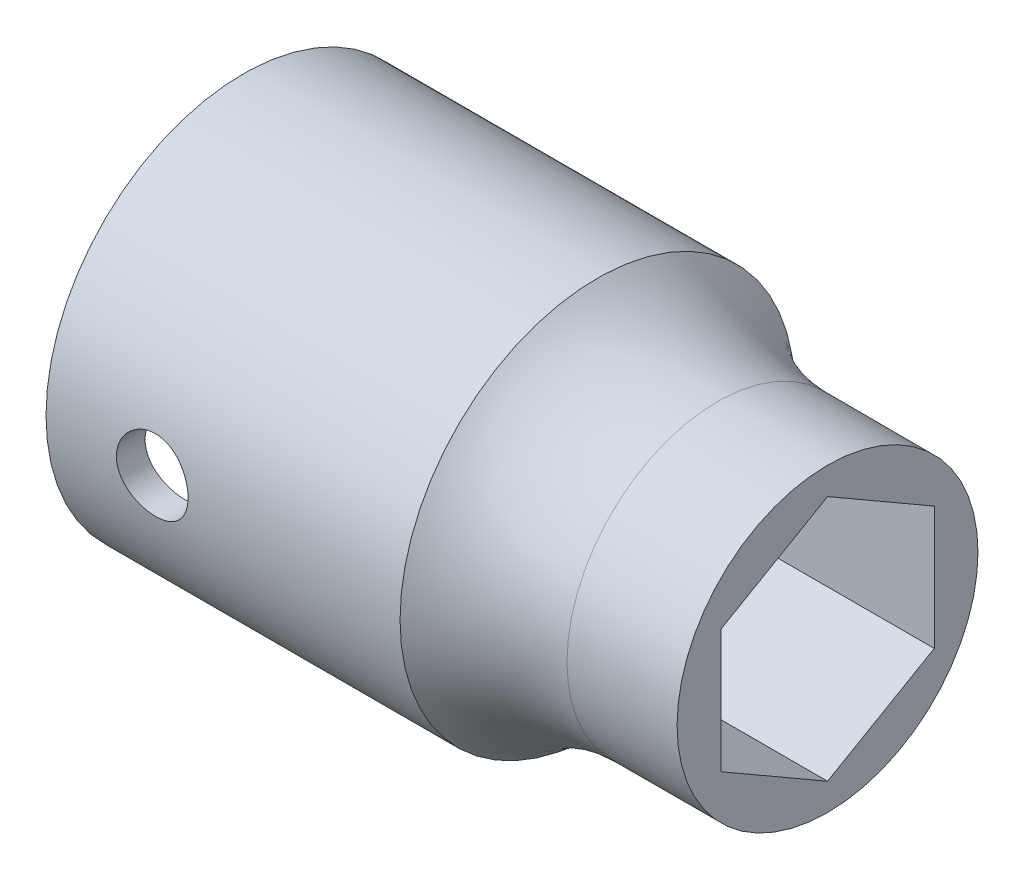
ISO-10303-21;
HEADER;
FILE_DESCRIPTION(('STEP AP214'),'2;1');
FILE_NAME('part.step','',(''),(''),'','','');
FILE_SCHEMA(('AUTOMOTIVE_DESIGN { 1 0 10303 214 1 1 1 1 }'));
ENDSEC;
DATA;
#1=APPLICATION_CONTEXT('core data for automotive mechanical design processes');
#2=APPLICATION_PROTOCOL_DEFINITION('international standard','automotive_design',2000,#1);
#3=PRODUCT_CONTEXT('',#1,'mechanical');
#4=PRODUCT('Part','Part','',(#3));
#5=PRODUCT_RELATED_PRODUCT_CATEGORY('part','',(#4));
#6=PRODUCT_DEFINITION_FORMATION('','',#4);
#7=PRODUCT_DEFINITION_CONTEXT('part definition',#1,'design');
#8=PRODUCT_DEFINITION('design','',#6,#7);
#9=PRODUCT_DEFINITION_SHAPE('','',#8);
#10=(LENGTH_UNIT() NAMED_UNIT(*) SI_UNIT(.MILLI.,.METRE.));
#11=(NAMED_UNIT(*) PLANE_ANGLE_UNIT() SI_UNIT($,.RADIAN.));
#12=(NAMED_UNIT(*) SI_UNIT($,.STERADIAN.) SOLID_ANGLE_UNIT());
#13=UNCERTAINTY_MEASURE_WITH_UNIT(LENGTH_MEASURE(1.E-05),#10,'distance_accuracy_value','');
#14=(GEOMETRIC_REPRESENTATION_CONTEXT(3) GLOBAL_UNCERTAINTY_ASSIGNED_CONTEXT((#13)) GLOBAL_UNIT_ASSIGNED_CONTEXT((#10,
#11,#12)) REPRESENTATION_CONTEXT('',''));
#15=CARTESIAN_POINT('',(0.,0.,0.));
#16=DIRECTION('',(0.,0.,1.));
#17=DIRECTION('',(1.,0.,0.));
#18=AXIS2_PLACEMENT_3D('',#15,#16,#17);
#19=CARTESIAN_POINT('',(30.,0.,0.));
#20=DIRECTION('',(-1.,0.,0.));
#21=DIRECTION('',(0.,0.,1.));
#22=AXIS2_PLACEMENT_3D('',#19,#20,#21);
#23=CYLINDRICAL_SURFACE('',#22,8.5);
#24=CARTESIAN_POINT('',(26.780671058236,0.,0.));
#25=DIRECTION('',(-1.,0.,0.));
#26=DIRECTION('',(0.,0.,1.));
#27=AXIS2_PLACEMENT_3D('',#24,#25,#26);
#28=CIRCLE('',#27,8.5);
#29=CARTESIAN_POINT('',(26.780671058236,0.,8.5));
#30=VERTEX_POINT('',#29);
#31=EDGE_CURVE('E12',#30,#30,#28,.F.);
#32=ORIENTED_EDGE('',*,*,#31,.T.);
#33=EDGE_LOOP('',(#32));
#34=FACE_BOUND('',#33,.T.);
#35=CARTESIAN_POINT('',(33.,0.,0.));
#36=DIRECTION('',(1.,0.,0.));
#37=DIRECTION('',(0.,0.,-1.));
#38=AXIS2_PLACEMENT_3D('',#35,#36,#37);
#39=CIRCLE('',#38,8.5);
#40=CARTESIAN_POINT('',(33.,0.,-8.5));
#41=VERTEX_POINT('',#40);
#42=EDGE_CURVE('E124',#41,#41,#39,.T.);
#43=ORIENTED_EDGE('',*,*,#42,.F.);
#44=EDGE_LOOP('',(#43));
#45=FACE_BOUND('',#44,.T.);
#46=ADVANCED_FACE('F42',(#34,#45),#23,.T.);
#47=CARTESIAN_POINT('',(21.5,-3.48142212321344,6.03));
#48=DIRECTION('',(0.,-0.866025403784439,0.5));
#49=DIRECTION('',(0.,-0.5,-0.866025403784439));
#50=AXIS2_PLACEMENT_3D('',#47,#48,#49);
#51=PLANE('',#50);
#52=DIRECTION('',(1.,0.,0.));
#53=VECTOR('',#52,1.);
#54=CARTESIAN_POINT('',(21.5,-3.48142212321344,6.03));
#55=LINE('',#54,#53);
#56=CARTESIAN_POINT('',(21.5,-3.48142212321344,6.03));
#57=VERTEX_POINT('',#56);
#58=CARTESIAN_POINT('',(33.,-3.48142212321344,6.03));
#59=VERTEX_POINT('',#58);
#60=EDGE_CURVE('E50',#57,#59,#55,.T.);
#61=ORIENTED_EDGE('',*,*,#60,.T.);
#62=DIRECTION('',(0.,-0.5,-0.866025403784439));
#63=VECTOR('',#62,1.);
#64=CARTESIAN_POINT('',(33.,-3.48142212321344,6.03));
#65=LINE('',#64,#63);
#66=CARTESIAN_POINT('',(33.,-6.96284424642689,0.));
#67=VERTEX_POINT('',#66);
#68=EDGE_CURVE('E97',#59,#67,#65,.T.);
#69=ORIENTED_EDGE('',*,*,#68,.T.);
#70=DIRECTION('',(1.,0.,0.));
#71=VECTOR('',#70,1.);
#72=CARTESIAN_POINT('',(21.5,-6.96284424642689,0.));
#73=LINE('',#72,#71);
#74=CARTESIAN_POINT('',(21.5,-6.96284424642689,0.));
#75=VERTEX_POINT('',#74);
#76=EDGE_CURVE('E242',#75,#67,#73,.T.);
#77=ORIENTED_EDGE('',*,*,#76,.F.);
#78=DIRECTION('',(0.,-0.5,-0.866025403784439));
#79=VECTOR('',#78,1.);
#80=CARTESIAN_POINT('',(21.5,-3.48142212321344,6.03));
#81=LINE('',#80,#79);
#82=EDGE_CURVE('E100',#57,#75,#81,.T.);
#83=ORIENTED_EDGE('',*,*,#82,.F.);
#84=EDGE_LOOP('',(#61,#69,#77,#83));
#85=FACE_BOUND('',#84,.T.);
#86=ADVANCED_FACE('F95',(#85),#51,.F.);
#87=CARTESIAN_POINT('',(21.5,3.48142212321345,6.03));
#88=DIRECTION('',(0.,0.,1.));
#89=DIRECTION('',(0.,-1.,0.));
#90=AXIS2_PLACEMENT_3D('',#87,#88,#89);
#91=PLANE('',#90);
#92=DIRECTION('',(1.,0.,0.));
#93=VECTOR('',#92,1.);
#94=CARTESIAN_POINT('',(21.5,3.48142212321345,6.03));
#95=LINE('',#94,#93);
#96=CARTESIAN_POINT('',(21.5,3.48142212321345,6.03));
#97=VERTEX_POINT('',#96);
#98=CARTESIAN_POINT('',(33.,3.48142212321345,6.03));
#99=VERTEX_POINT('',#98);
#100=EDGE_CURVE('E64',#97,#99,#95,.T.);
#101=ORIENTED_EDGE('',*,*,#100,.T.);
#102=DIRECTION('',(0.,-1.,0.));
#103=VECTOR('',#102,1.);
#104=CARTESIAN_POINT('',(33.,3.48142212321345,6.03));
#105=LINE('',#104,#103);
#106=EDGE_CURVE('E104',#99,#59,#105,.T.);
#107=ORIENTED_EDGE('',*,*,#106,.T.);
#108=ORIENTED_EDGE('',*,*,#60,.F.);
#109=DIRECTION('',(0.,-1.,0.));
#110=VECTOR('',#109,1.);
#111=CARTESIAN_POINT('',(21.5,3.48142212321345,6.03));
#112=LINE('',#111,#110);
#113=EDGE_CURVE('E226',#97,#57,#112,.T.);
#114=ORIENTED_EDGE('',*,*,#113,.F.);
#115=EDGE_LOOP('',(#101,#107,#108,#114));
#116=FACE_BOUND('',#115,.T.);
#117=ADVANCED_FACE('F105',(#116),#91,.F.);
#118=CARTESIAN_POINT('',(21.5,6.96284424642689,0.));
#119=DIRECTION('',(0.,0.866025403784439,0.5));
#120=DIRECTION('',(0.,-0.5,0.866025403784439));
#121=AXIS2_PLACEMENT_3D('',#118,#119,#120);
#122=PLANE('',#121);
#123=DIRECTION('',(1.,0.,0.));
#124=VECTOR('',#123,1.);
#125=CARTESIAN_POINT('',(21.5,6.96284424642689,0.));
#126=LINE('',#125,#124);
#127=CARTESIAN_POINT('',(21.5,6.96284424642689,0.));
#128=VERTEX_POINT('',#127);
#129=CARTESIAN_POINT('',(33.,6.96284424642689,0.));
#130=VERTEX_POINT('',#129);
#131=EDGE_CURVE('E245',#128,#130,#126,.T.);
#132=ORIENTED_EDGE('',*,*,#131,.T.);
#133=DIRECTION('',(0.,-0.5,0.866025403784439));
#134=VECTOR('',#133,1.);
#135=CARTESIAN_POINT('',(33.,6.96284424642689,0.));
#136=LINE('',#135,#134);
#137=EDGE_CURVE('E122',#130,#99,#136,.T.);
#138=ORIENTED_EDGE('',*,*,#137,.T.);
#139=ORIENTED_EDGE('',*,*,#100,.F.);
#140=DIRECTION('',(0.,-0.5,0.866025403784439));
#141=VECTOR('',#140,1.);
#142=CARTESIAN_POINT('',(21.5,6.96284424642689,0.));
#143=LINE('',#142,#141);
#144=EDGE_CURVE('E240',#128,#97,#143,.T.);
#145=ORIENTED_EDGE('',*,*,#144,.F.);
#146=EDGE_LOOP('',(#132,#138,#139,#145));
#147=FACE_BOUND('',#146,.T.);
#148=ADVANCED_FACE('F208',(#147),#122,.F.);
#149=CARTESIAN_POINT('',(21.5,3.48142212321344,-6.03));
#150=DIRECTION('',(0.,0.866025403784439,-0.5));
#151=DIRECTION('',(0.,0.5,0.866025403784439));
#152=AXIS2_PLACEMENT_3D('',#149,#150,#151);
#153=PLANE('',#152);
#154=DIRECTION('',(1.,0.,0.));
#155=VECTOR('',#154,1.);
#156=CARTESIAN_POINT('',(21.5,3.48142212321344,-6.03));
#157=LINE('',#156,#155);
#158=CARTESIAN_POINT('',(21.5,3.48142212321344,-6.03));
#159=VERTEX_POINT('',#158);
#160=CARTESIAN_POINT('',(33.,3.48142212321344,-6.03));
#161=VERTEX_POINT('',#160);
#162=EDGE_CURVE('E247',#159,#161,#157,.T.);
#163=ORIENTED_EDGE('',*,*,#162,.T.);
#164=DIRECTION('',(0.,0.5,0.866025403784439));
#165=VECTOR('',#164,1.);
#166=CARTESIAN_POINT('',(33.,3.48142212321344,-6.03));
#167=LINE('',#166,#165);
#168=EDGE_CURVE('E119',#161,#130,#167,.T.);
#169=ORIENTED_EDGE('',*,*,#168,.T.);
#170=ORIENTED_EDGE('',*,*,#131,.F.);
#171=DIRECTION('',(0.,0.5,0.866025403784439));
#172=VECTOR('',#171,1.);
#173=CARTESIAN_POINT('',(21.5,3.48142212321344,-6.03));
#174=LINE('',#173,#172);
#175=EDGE_CURVE('E237',#159,#128,#174,.T.);
#176=ORIENTED_EDGE('',*,*,#175,.F.);
#177=EDGE_LOOP('',(#163,#169,#170,#176));
#178=FACE_BOUND('',#177,.T.);
#179=ADVANCED_FACE('F204',(#178),#153,.F.);
#180=CARTESIAN_POINT('',(21.5,-3.48142212321344,-6.03));
#181=DIRECTION('',(0.,0.,-1.));
#182=DIRECTION('',(0.,1.,0.));
#183=AXIS2_PLACEMENT_3D('',#180,#181,#182);
#184=PLANE('',#183);
#185=DIRECTION('',(1.,0.,0.));
#186=VECTOR('',#185,1.);
#187=CARTESIAN_POINT('',(21.5,-3.48142212321344,-6.03));
#188=LINE('',#187,#186);
#189=CARTESIAN_POINT('',(21.5,-3.48142212321344,-6.03));
#190=VERTEX_POINT('',#189);
#191=CARTESIAN_POINT('',(33.,-3.48142212321344,-6.03));
#192=VERTEX_POINT('',#191);
#193=EDGE_CURVE('E249',#190,#192,#188,.T.);
#194=ORIENTED_EDGE('',*,*,#193,.T.);
#195=DIRECTION('',(0.,1.,0.));
#196=VECTOR('',#195,1.);
#197=CARTESIAN_POINT('',(33.,-3.48142212321344,-6.03));
#198=LINE('',#197,#196);
#199=EDGE_CURVE('E114',#192,#161,#198,.T.);
#200=ORIENTED_EDGE('',*,*,#199,.T.);
#201=ORIENTED_EDGE('',*,*,#162,.F.);
#202=DIRECTION('',(0.,1.,0.));
#203=VECTOR('',#202,1.);
#204=CARTESIAN_POINT('',(21.5,-3.48142212321344,-6.03));
#205=LINE('',#204,#203);
#206=EDGE_CURVE('E229',#190,#159,#205,.T.);
#207=ORIENTED_EDGE('',*,*,#206,.F.);
#208=EDGE_LOOP('',(#194,#200,#201,#207));
#209=FACE_BOUND('',#208,.T.);
#210=ADVANCED_FACE('F200',(#209),#184,.F.);
#211=CARTESIAN_POINT('',(21.5,-6.96284424642689,0.));
#212=DIRECTION('',(0.,-0.866025403784439,-0.5));
#213=DIRECTION('',(0.,0.5,-0.866025403784439));
#214=AXIS2_PLACEMENT_3D('',#211,#212,#213);
#215=PLANE('',#214);
#216=ORIENTED_EDGE('',*,*,#76,.T.);
#217=DIRECTION('',(0.,0.5,-0.866025403784439));
#218=VECTOR('',#217,1.);
#219=CARTESIAN_POINT('',(33.,-6.96284424642689,0.));
#220=LINE('',#219,#218);
#221=EDGE_CURVE('E112',#67,#192,#220,.T.);
#222=ORIENTED_EDGE('',*,*,#221,.T.);
#223=ORIENTED_EDGE('',*,*,#193,.F.);
#224=DIRECTION('',(0.,0.5,-0.866025403784439));
#225=VECTOR('',#224,1.);
#226=CARTESIAN_POINT('',(21.5,-6.96284424642689,0.));
#227=LINE('',#226,#225);
#228=EDGE_CURVE('E225',#75,#190,#227,.T.);
#229=ORIENTED_EDGE('',*,*,#228,.F.);
#230=EDGE_LOOP('',(#216,#222,#223,#229));
#231=FACE_BOUND('',#230,.T.);
#232=ADVANCED_FACE('F196',(#231),#215,.F.);
#233=CARTESIAN_POINT('',(21.5,0.,0.));
#234=DIRECTION('',(1.,0.,0.));
#235=DIRECTION('',(0.,0.,-1.));
#236=AXIS2_PLACEMENT_3D('',#233,#234,#235);
#237=PLANE('',#236);
#238=CARTESIAN_POINT('',(21.5,0.,0.));
#239=DIRECTION('',(1.,0.,0.));
#240=DIRECTION('',(0.,0.,-1.));
#241=AXIS2_PLACEMENT_3D('',#238,#239,#240);
#242=CIRCLE('',#241,2.035);
#243=CARTESIAN_POINT('',(21.5,0.,-2.035));
#244=VERTEX_POINT('',#243);
#245=EDGE_CURVE('E221',#244,#244,#242,.F.);
#246=ORIENTED_EDGE('',*,*,#245,.T.);
#247=EDGE_LOOP('',(#246));
#248=FACE_BOUND('',#247,.T.);
#249=ORIENTED_EDGE('',*,*,#82,.T.);
#250=ORIENTED_EDGE('',*,*,#228,.T.);
#251=ORIENTED_EDGE('',*,*,#206,.T.);
#252=ORIENTED_EDGE('',*,*,#175,.T.);
#253=ORIENTED_EDGE('',*,*,#144,.T.);
#254=ORIENTED_EDGE('',*,*,#113,.T.);
#255=EDGE_LOOP('',(#249,#250,#251,#252,#253,#254));
#256=FACE_BOUND('',#255,.T.);
#257=ADVANCED_FACE('F199',(#248,#256),#237,.T.);
#258=CARTESIAN_POINT('',(20.,0.,0.));
#259=DIRECTION('',(-1.,0.,0.));
#260=DIRECTION('',(0.,0.,1.));
#261=AXIS2_PLACEMENT_3D('',#258,#259,#260);
#262=CYLINDRICAL_SURFACE('',#261,11.15);
#263=CARTESIAN_POINT('',(8.025,0.,-11.15));
#264=CARTESIAN_POINT('',(8.02499562505742,-0.112751441498885,-11.1499979832852));
#265=CARTESIAN_POINT('',(8.0155512262252,-0.225560557169414,-11.1482720415652));
#266=CARTESIAN_POINT('',(7.97804495219576,-0.448004282671172,-11.141553226036));
#267=CARTESIAN_POINT('',(7.94996695042661,-0.557636056800047,-11.1365575224417));
#268=CARTESIAN_POINT('',(7.87607795775399,-0.770475525642831,-11.123858458089));
#269=CARTESIAN_POINT('',(7.83028254108785,-0.873688770237357,-11.116157475912));
#270=CARTESIAN_POINT('',(7.72230191170722,-1.07095610871707,-11.0988904937099));
#271=CARTESIAN_POINT('',(7.66011818531407,-1.16501103214817,-11.0893246628359));
#272=CARTESIAN_POINT('',(7.5203818709834,-1.34236222690822,-11.0692646511338));
#273=CARTESIAN_POINT('',(7.44268053434301,-1.42554036098216,-11.0587620767329));
#274=CARTESIAN_POINT('',(7.27443470680536,-1.57775528987778,-11.0380751459057));
#275=CARTESIAN_POINT('',(7.18388932825842,-1.64679110651953,-11.0278908115324));
#276=CARTESIAN_POINT('',(6.99169757080004,-1.76924787441813,-11.0089119986884));
#277=CARTESIAN_POINT('',(6.88997408088543,-1.82254962842865,-11.000128350515));
#278=CARTESIAN_POINT('',(6.67883042806619,-1.91126242001943,-10.9850632020692));
#279=CARTESIAN_POINT('',(6.56941088695242,-1.94667490104931,-10.9787814999284));
#280=CARTESIAN_POINT('',(6.34724187899659,-1.99822677901939,-10.9695157156771));
#281=CARTESIAN_POINT('',(6.23454157522089,-2.01457161362773,-10.9664965095694));
#282=CARTESIAN_POINT('',(6.00796084831492,-2.02816169132043,-10.9639915712785));
#283=CARTESIAN_POINT('',(5.89408052521237,-2.02540854028731,-10.9645055420029));
#284=CARTESIAN_POINT('',(5.6698543013851,-2.00104760196768,-10.9689768790016));
#285=CARTESIAN_POINT('',(5.55948213923992,-1.97967258316176,-10.9728917334019));
#286=CARTESIAN_POINT('',(5.34391700298593,-1.91904086602328,-10.9836570268792));
#287=CARTESIAN_POINT('',(5.2387242367683,-1.87978345057233,-10.9905075836828));
#288=CARTESIAN_POINT('',(5.0358182345903,-1.78427123343148,-11.0064172743766));
#289=CARTESIAN_POINT('',(4.93815060987423,-1.72792166138741,-11.0154886665362));
#290=CARTESIAN_POINT('',(4.75356915416535,-1.59989178782466,-11.0348096909086));
#291=CARTESIAN_POINT('',(4.66665635043035,-1.52821002361731,-11.0450594354928));
#292=CARTESIAN_POINT('',(4.50470604723019,-1.37029166177545,-11.0657679780013));
#293=CARTESIAN_POINT('',(4.42986283952046,-1.28385578433711,-11.0762276280649));
#294=CARTESIAN_POINT('',(4.29571069026219,-1.09955171148547,-11.0960381269903));
#295=CARTESIAN_POINT('',(4.23640188675528,-1.0016834144927,-11.1053889659985));
#296=CARTESIAN_POINT('',(4.13497672080002,-0.79709583896337,-11.1219454036795));
#297=CARTESIAN_POINT('',(4.09287966956332,-0.690366779419894,-11.129148590294));
#298=CARTESIAN_POINT('',(4.02726466216098,-0.471192514784951,-11.1405792933285));
#299=CARTESIAN_POINT('',(4.00374485614038,-0.358747880016924,-11.144807106021));
#300=CARTESIAN_POINT('',(3.97622033918205,-0.133006805896866,-11.149770258007));
#301=CARTESIAN_POINT('',(3.97194927049385,-0.0197438566380171,-11.1505532618004));
#302=CARTESIAN_POINT('',(3.98233027157826,0.205878153313084,-11.1486699090568));
#303=CARTESIAN_POINT('',(3.99698147130862,0.31823725532504,-11.1460037111135));
#304=CARTESIAN_POINT('',(4.0445696246511,0.538023755801919,-11.1375511577119));
#305=CARTESIAN_POINT('',(4.07737265478812,0.645481106972016,-11.1317876628634));
#306=CARTESIAN_POINT('',(4.16018902168858,0.853371074520221,-11.1177840665348));
#307=CARTESIAN_POINT('',(4.21020346974387,0.953803236798088,-11.1095438051413));
#308=CARTESIAN_POINT('',(4.32661848685181,1.14593464582843,-11.0913818972793));
#309=CARTESIAN_POINT('',(4.39318287935223,1.23753304071696,-11.0814437720618));
#310=CARTESIAN_POINT('',(4.54058551629188,1.40835504248224,-11.0610329696644));
#311=CARTESIAN_POINT('',(4.62142500573406,1.48757756886059,-11.0505602459162));
#312=CARTESIAN_POINT('',(4.79628575772945,1.63240387587698,-11.030103624073));
#313=CARTESIAN_POINT('',(4.89045819092202,1.69782639847603,-11.0201274075185));
#314=CARTESIAN_POINT('',(5.0886127729976,1.8119237110392,-11.0019445699367));
#315=CARTESIAN_POINT('',(5.19259457158672,1.86059909875774,-10.9937378857535));
#316=CARTESIAN_POINT('',(5.40694237801996,1.93955925901505,-10.9800828195049));
#317=CARTESIAN_POINT('',(5.51727616090717,1.96992920268785,-10.9746216830399));
#318=CARTESIAN_POINT('',(5.74158809566807,2.01168074938532,-10.9670460344435));
#319=CARTESIAN_POINT('',(5.85556586326813,2.02306434791327,-10.9649311706132));
#320=CARTESIAN_POINT('',(6.08211648941359,2.02645653041378,-10.9643045824531));
#321=CARTESIAN_POINT('',(6.19468502285506,2.01875083500643,-10.9657397226605));
#322=CARTESIAN_POINT('',(6.41689421889181,1.98480643710447,-10.9719340190409));
#323=CARTESIAN_POINT('',(6.52653489646821,1.95856782945711,-10.9766931582025));
#324=CARTESIAN_POINT('',(6.73963505420474,1.88841978215637,-10.9889774747292));
#325=CARTESIAN_POINT('',(6.84310438823642,1.84453942861439,-10.9964980974498));
#326=CARTESIAN_POINT('',(7.04125838807804,1.74038413089695,-11.0134615364686));
#327=CARTESIAN_POINT('',(7.13594248616091,1.68010812817598,-11.0229044768666));
#328=CARTESIAN_POINT('',(7.31527320124201,1.54387141939681,-11.0428145558497));
#329=CARTESIAN_POINT('',(7.39975996008093,1.46770208691575,-11.0532942287642));
#330=CARTESIAN_POINT('',(7.55484876477795,1.30227756702941,-11.074001419602));
#331=CARTESIAN_POINT('',(7.62544761425962,1.21301937538492,-11.0842288790045));
#332=CARTESIAN_POINT('',(7.75130538859712,1.02305756900487,-11.1033793829986));
#333=CARTESIAN_POINT('',(7.80643098433604,0.922264416451276,-11.1122907942049));
#334=CARTESIAN_POINT('',(7.89887925409135,0.712720621515098,-11.1276917600447));
#335=CARTESIAN_POINT('',(7.93621894903113,0.603977702426962,-11.1341836288554));
#336=CARTESIAN_POINT('',(7.98429890957221,0.412402955038714,-11.1426629107678));
#337=CARTESIAN_POINT('',(7.99953622432132,0.330703239235582,-11.1453990283165));
#338=CARTESIAN_POINT('',(8.01988826477507,0.166012752523975,-11.1490682948498));
#339=CARTESIAN_POINT('',(8.02500322139147,0.08302201110997,-11.150001484963));
#340=CARTESIAN_POINT('',(8.025,0.,-11.15));
#341=B_SPLINE_CURVE_WITH_KNOTS('',3,(#263,#264,#265,#266,#267,#268,#269,#270,#271,#272,#273,
#274,#275,#276,#277,#278,#279,#280,#281,#282,#283,#284,#285,#286,#287,#288,#289,#290,#291,#292,
#293,#294,#295,#296,#297,#298,#299,#300,#301,#302,#303,#304,#305,#306,#307,#308,#309,#310,#311,
#312,#313,#314,#315,#316,#317,#318,#319,#320,#321,#322,#323,#324,#325,#326,#327,#328,#329,#330,
#331,#332,#333,#334,#335,#336,#337,#338,#339,#340),.UNSPECIFIED.,.T.,.F.,(4,2,2,2,2,2,2,2,2,2,2,
2,2,2,2,2,2,2,2,2,2,2,2,2,2,2,2,2,2,2,2,2,2,2,2,2,2,2,4),(0.,0.337950751909272,
0.676194367572777,1.01414132817343,1.35205764955411,1.69338373089736,2.03473341273462,
2.37860634997341,2.72245153635968,3.06255683104115,3.40263352780976,3.73851937471229,
4.07441869246729,4.41221560429907,4.75004475628665,5.09286208301756,5.43568245598427,
5.77888641736311,6.12205619942142,6.46046243149809,6.79885310427554,7.13477980461174,
7.47072819884164,7.81014457252122,8.14959056304193,8.49325013448978,8.83689743844545,
9.17893323165907,9.52093307395322,9.85784502043559,10.1947552426914,10.531112260987,
10.8674910005181,11.2085995875099,11.5497865908448,11.8938290818196,12.2375416628846,
12.486389844108,12.7352323485287),.UNSPECIFIED.);
#342=CARTESIAN_POINT('',(8.025,0.,-11.15));
#343=VERTEX_POINT('',#342);
#344=EDGE_CURVE('E136',#343,#343,#341,.T.);
#345=ORIENTED_EDGE('',*,*,#344,.F.);
#346=EDGE_LOOP('',(#345));
#347=FACE_BOUND('',#346,.T.);
#348=CARTESIAN_POINT('',(8.025,0.,11.15));
#349=CARTESIAN_POINT('',(8.02499562505742,0.112751441498885,11.1499979832852));
#350=CARTESIAN_POINT('',(8.0155512262252,0.225560557169414,11.1482720415652));
#351=CARTESIAN_POINT('',(7.97804495219576,0.448004282671172,11.141553226036));
#352=CARTESIAN_POINT('',(7.94996695042661,0.557636056800047,11.1365575224417));
#353=CARTESIAN_POINT('',(7.87607795775399,0.770475525642831,11.123858458089));
#354=CARTESIAN_POINT('',(7.83028254108785,0.873688770237357,11.116157475912));
#355=CARTESIAN_POINT('',(7.72230191170722,1.07095610871707,11.0988904937099));
#356=CARTESIAN_POINT('',(7.66011818531407,1.16501103214817,11.0893246628359));
#357=CARTESIAN_POINT('',(7.5203818709834,1.34236222690822,11.0692646511338));
#358=CARTESIAN_POINT('',(7.44268053434301,1.42554036098216,11.0587620767329));
#359=CARTESIAN_POINT('',(7.27443470680536,1.57775528987778,11.0380751459057));
#360=CARTESIAN_POINT('',(7.18388932825842,1.64679110651953,11.0278908115324));
#361=CARTESIAN_POINT('',(6.99169757080004,1.76924787441813,11.0089119986884));
#362=CARTESIAN_POINT('',(6.88997408088543,1.82254962842865,11.000128350515));
#363=CARTESIAN_POINT('',(6.67883042806619,1.91126242001943,10.9850632020692));
#364=CARTESIAN_POINT('',(6.56941088695242,1.94667490104931,10.9787814999284));
#365=CARTESIAN_POINT('',(6.34724187899659,1.99822677901939,10.9695157156771));
#366=CARTESIAN_POINT('',(6.23454157522089,2.01457161362773,10.9664965095694));
#367=CARTESIAN_POINT('',(6.00796084831492,2.02816169132043,10.9639915712785));
#368=CARTESIAN_POINT('',(5.89408052521237,2.02540854028731,10.9645055420029));
#369=CARTESIAN_POINT('',(5.6698543013851,2.00104760196768,10.9689768790016));
#370=CARTESIAN_POINT('',(5.55948213923992,1.97967258316176,10.9728917334019));
#371=CARTESIAN_POINT('',(5.34391700298593,1.91904086602328,10.9836570268792));
#372=CARTESIAN_POINT('',(5.2387242367683,1.87978345057233,10.9905075836828));
#373=CARTESIAN_POINT('',(5.0358182345903,1.78427123343148,11.0064172743766));
#374=CARTESIAN_POINT('',(4.93815060987423,1.72792166138741,11.0154886665362));
#375=CARTESIAN_POINT('',(4.75356915416535,1.59989178782466,11.0348096909086));
#376=CARTESIAN_POINT('',(4.66665635043035,1.52821002361731,11.0450594354928));
#377=CARTESIAN_POINT('',(4.50470604723019,1.37029166177545,11.0657679780013));
#378=CARTESIAN_POINT('',(4.42986283952046,1.28385578433711,11.0762276280649));
#379=CARTESIAN_POINT('',(4.29571069026219,1.09955171148547,11.0960381269903));
#380=CARTESIAN_POINT('',(4.23640188675528,1.0016834144927,11.1053889659985));
#381=CARTESIAN_POINT('',(4.13497672080002,0.79709583896337,11.1219454036795));
#382=CARTESIAN_POINT('',(4.09287966956332,0.690366779419894,11.129148590294));
#383=CARTESIAN_POINT('',(4.02726466216098,0.471192514784951,11.1405792933285));
#384=CARTESIAN_POINT('',(4.00374485614038,0.358747880016924,11.144807106021));
#385=CARTESIAN_POINT('',(3.97622033918205,0.133006805896866,11.149770258007));
#386=CARTESIAN_POINT('',(3.97194927049385,0.0197438566380171,11.1505532618004));
#387=CARTESIAN_POINT('',(3.98233027157826,-0.205878153313084,11.1486699090568));
#388=CARTESIAN_POINT('',(3.99698147130862,-0.31823725532504,11.1460037111135));
#389=CARTESIAN_POINT('',(4.0445696246511,-0.538023755801919,11.1375511577119));
#390=CARTESIAN_POINT('',(4.07737265478812,-0.645481106972016,11.1317876628634));
#391=CARTESIAN_POINT('',(4.16018902168858,-0.853371074520221,11.1177840665348));
#392=CARTESIAN_POINT('',(4.21020346974387,-0.953803236798088,11.1095438051413));
#393=CARTESIAN_POINT('',(4.32661848685181,-1.14593464582843,11.0913818972793));
#394=CARTESIAN_POINT('',(4.39318287935223,-1.23753304071696,11.0814437720618));
#395=CARTESIAN_POINT('',(4.54058551629188,-1.40835504248224,11.0610329696644));
#396=CARTESIAN_POINT('',(4.62142500573406,-1.48757756886059,11.0505602459162));
#397=CARTESIAN_POINT('',(4.79628575772945,-1.63240387587698,11.030103624073));
#398=CARTESIAN_POINT('',(4.89045819092202,-1.69782639847603,11.0201274075185));
#399=CARTESIAN_POINT('',(5.0886127729976,-1.8119237110392,11.0019445699367));
#400=CARTESIAN_POINT('',(5.19259457158672,-1.86059909875774,10.9937378857535));
#401=CARTESIAN_POINT('',(5.40694237801996,-1.93955925901505,10.9800828195049));
#402=CARTESIAN_POINT('',(5.51727616090717,-1.96992920268785,10.9746216830399));
#403=CARTESIAN_POINT('',(5.74158809566807,-2.01168074938532,10.9670460344435));
#404=CARTESIAN_POINT('',(5.85556586326813,-2.02306434791327,10.9649311706132));
#405=CARTESIAN_POINT('',(6.08211648941359,-2.02645653041378,10.9643045824531));
#406=CARTESIAN_POINT('',(6.19468502285506,-2.01875083500643,10.9657397226605));
#407=CARTESIAN_POINT('',(6.41689421889181,-1.98480643710447,10.9719340190409));
#408=CARTESIAN_POINT('',(6.52653489646821,-1.95856782945711,10.9766931582025));
#409=CARTESIAN_POINT('',(6.73963505420474,-1.88841978215637,10.9889774747292));
#410=CARTESIAN_POINT('',(6.84310438823642,-1.84453942861439,10.9964980974498));
#411=CARTESIAN_POINT('',(7.04125838807804,-1.74038413089695,11.0134615364686));
#412=CARTESIAN_POINT('',(7.13594248616091,-1.68010812817598,11.0229044768666));
#413=CARTESIAN_POINT('',(7.31527320124201,-1.54387141939681,11.0428145558497));
#414=CARTESIAN_POINT('',(7.39975996008093,-1.46770208691575,11.0532942287642));
#415=CARTESIAN_POINT('',(7.55484876477795,-1.30227756702941,11.074001419602));
#416=CARTESIAN_POINT('',(7.62544761425962,-1.21301937538492,11.0842288790045));
#417=CARTESIAN_POINT('',(7.75130538859712,-1.02305756900487,11.1033793829986));
#418=CARTESIAN_POINT('',(7.80643098433604,-0.922264416451276,11.1122907942049));
#419=CARTESIAN_POINT('',(7.89887925409135,-0.712720621515098,11.1276917600447));
#420=CARTESIAN_POINT('',(7.93621894903113,-0.603977702426962,11.1341836288554));
#421=CARTESIAN_POINT('',(7.98429890957221,-0.412402955038714,11.1426629107678));
#422=CARTESIAN_POINT('',(7.99953622432132,-0.330703239235582,11.1453990283165));
#423=CARTESIAN_POINT('',(8.01988826477507,-0.166012752523975,11.1490682948498));
#424=CARTESIAN_POINT('',(8.02500322139147,-0.08302201110997,11.150001484963));
#425=CARTESIAN_POINT('',(8.025,0.,11.15));
#426=B_SPLINE_CURVE_WITH_KNOTS('',3,(#348,#349,#350,#351,#352,#353,#354,#355,#356,#357,#358,
#359,#360,#361,#362,#363,#364,#365,#366,#367,#368,#369,#370,#371,#372,#373,#374,#375,#376,#377,
#378,#379,#380,#381,#382,#383,#384,#385,#386,#387,#388,#389,#390,#391,#392,#393,#394,#395,#396,
#397,#398,#399,#400,#401,#402,#403,#404,#405,#406,#407,#408,#409,#410,#411,#412,#413,#414,#415,
#416,#417,#418,#419,#420,#421,#422,#423,#424,#425),.UNSPECIFIED.,.T.,.F.,(4,2,2,2,2,2,2,2,2,2,2,
2,2,2,2,2,2,2,2,2,2,2,2,2,2,2,2,2,2,2,2,2,2,2,2,2,2,2,4),(0.,0.337950751909272,
0.676194367572777,1.01414132817343,1.35205764955411,1.69338373089736,2.03473341273462,
2.37860634997341,2.72245153635968,3.06255683104115,3.40263352780976,3.73851937471229,
4.07441869246729,4.41221560429907,4.75004475628665,5.09286208301756,5.43568245598427,
5.77888641736311,6.12205619942142,6.46046243149809,6.79885310427554,7.13477980461174,
7.47072819884164,7.81014457252122,8.14959056304193,8.49325013448978,8.83689743844545,
9.17893323165907,9.52093307395322,9.85784502043559,10.1947552426914,10.531112260987,
10.8674910005181,11.2085995875099,11.5497865908448,11.8938290818196,12.2375416628846,
12.486389844108,12.7352323485287),.UNSPECIFIED.);
#427=CARTESIAN_POINT('',(8.025,0.,11.15));
#428=VERTEX_POINT('',#427);
#429=EDGE_CURVE('E128',#428,#428,#426,.T.);
#430=ORIENTED_EDGE('',*,*,#429,.F.);
#431=EDGE_LOOP('',(#430));
#432=FACE_BOUND('',#431,.T.);
#433=CARTESIAN_POINT('',(20.,0.,0.));
#434=DIRECTION('',(-1.,0.,0.));
#435=DIRECTION('',(0.,0.,1.));
#436=AXIS2_PLACEMENT_3D('',#433,#434,#435);
#437=CIRCLE('',#436,11.15);
#438=CARTESIAN_POINT('',(20.,0.,11.15));
#439=VERTEX_POINT('',#438);
#440=EDGE_CURVE('E227',#439,#439,#437,.T.);
#441=ORIENTED_EDGE('',*,*,#440,.T.);
#442=EDGE_LOOP('',(#441));
#443=FACE_BOUND('',#442,.T.);
#444=CARTESIAN_POINT('',(0.,0.,0.));
#445=DIRECTION('',(-1.,0.,0.));
#446=DIRECTION('',(0.,0.,1.));
#447=AXIS2_PLACEMENT_3D('',#444,#445,#446);
#448=CIRCLE('',#447,11.15);
#449=CARTESIAN_POINT('',(0.,0.,11.15));
#450=VERTEX_POINT('',#449);
#451=EDGE_CURVE('E232',#450,#450,#448,.T.);
#452=ORIENTED_EDGE('',*,*,#451,.F.);
#453=EDGE_LOOP('',(#452));
#454=FACE_BOUND('',#453,.T.);
#455=ADVANCED_FACE('F142',(#347,#432,#443,#454),#262,.T.);
#456=CARTESIAN_POINT('',(0.,0.,0.));
#457=DIRECTION('',(1.,0.,0.));
#458=DIRECTION('',(0.,0.,-1.));
#459=AXIS2_PLACEMENT_3D('',#456,#457,#458);
#460=PLANE('',#459);
#461=CARTESIAN_POINT('',(0.,0.,0.));
#462=DIRECTION('',(-1.,0.,0.));
#463=DIRECTION('',(0.,0.,1.));
#464=AXIS2_PLACEMENT_3D('',#461,#462,#463);
#465=CIRCLE('',#464,9.53);
#466=CARTESIAN_POINT('',(0.,0.,9.53));
#467=VERTEX_POINT('',#466);
#468=EDGE_CURVE('E256',#467,#467,#465,.T.);
#469=ORIENTED_EDGE('',*,*,#468,.F.);
#470=EDGE_LOOP('',(#469));
#471=FACE_BOUND('',#470,.T.);
#472=ORIENTED_EDGE('',*,*,#451,.T.);
#473=EDGE_LOOP('',(#472));
#474=FACE_BOUND('',#473,.T.);
#475=ADVANCED_FACE('F171',(#471,#474),#460,.F.);
#476=CARTESIAN_POINT('',(19.,0.,0.));
#477=DIRECTION('',(-1.,0.,0.));
#478=DIRECTION('',(0.,0.,1.));
#479=AXIS2_PLACEMENT_3D('',#476,#477,#478);
#480=CYLINDRICAL_SURFACE('',#479,9.53);
#481=CARTESIAN_POINT('',(8.025,0.,9.53));
#482=CARTESIAN_POINT('',(8.02499605484121,0.112391076024051,9.52999791998118));
#483=CARTESIAN_POINT('',(8.01561154537522,0.224830560616815,9.52799151766003));
#484=CARTESIAN_POINT('',(7.9783572855907,0.446521061097081,9.52018128294833));
#485=CARTESIAN_POINT('',(7.95047382041502,0.555769648513566,9.51437463315271));
#486=CARTESIAN_POINT('',(7.87713017756362,0.767841945267301,9.49961107080176));
#487=CARTESIAN_POINT('',(7.83168784114006,0.870672053512198,9.49065735675343));
#488=CARTESIAN_POINT('',(7.72457180639848,1.0672436616396,9.47056841270555));
#489=CARTESIAN_POINT('',(7.66289871359672,1.16098550039713,9.45943326409213));
#490=CARTESIAN_POINT('',(7.52407971479104,1.33814850793602,9.43601409692603));
#491=CARTESIAN_POINT('',(7.44673459369688,1.42141179806432,9.42371650153334));
#492=CARTESIAN_POINT('',(7.27919496134475,1.57388586013189,9.39945517454531));
#493=CARTESIAN_POINT('',(7.18899935593422,1.64309543425141,9.38749147148302));
#494=CARTESIAN_POINT('',(6.99716258712654,1.76618561713956,9.36511910459928));
#495=CARTESIAN_POINT('',(6.89541237734158,1.81989972511122,9.35472786349085));
#496=CARTESIAN_POINT('',(6.68407289879637,1.90940668001652,9.33687115194372));
#497=CARTESIAN_POINT('',(6.57448451253269,1.94520154085102,9.32940535274218));
#498=CARTESIAN_POINT('',(6.35228740696906,1.99733529239562,9.3183828073594));
#499=CARTESIAN_POINT('',(6.23974690592738,2.01395285883966,9.31477012961065));
#500=CARTESIAN_POINT('',(6.01342180365645,2.02812650767194,9.31169476428007));
#501=CARTESIAN_POINT('',(5.89963734799341,2.02568479701146,9.31223159620956));
#502=CARTESIAN_POINT('',(5.67611463832872,2.00203382384055,9.31734389558492));
#503=CARTESIAN_POINT('',(5.56634046104001,1.98114681840531,9.32185001239576));
#504=CARTESIAN_POINT('',(5.35189074151191,1.92170806860866,9.3342836640529));
#505=CARTESIAN_POINT('',(5.24721547116593,1.88315538338325,9.34221138113037));
#506=CARTESIAN_POINT('',(5.04502118984767,1.78917971881759,9.36066419581837));
#507=CARTESIAN_POINT('',(4.94756219826487,1.7336315237042,9.37120845824025));
#508=CARTESIAN_POINT('',(4.7632288840781,1.60732979486708,9.39369435181197));
#509=CARTESIAN_POINT('',(4.67635592944405,1.53657429925349,9.40563616316862));
#510=CARTESIAN_POINT('',(4.51380390571457,1.38015389285475,9.42987016453048));
#511=CARTESIAN_POINT('',(4.438388945449,1.29421460158541,9.442164536257));
#512=CARTESIAN_POINT('',(4.30300047594627,1.11077128132731,9.4654964218287));
#513=CARTESIAN_POINT('',(4.2430272167527,1.01326706510796,9.47653391531995));
#514=CARTESIAN_POINT('',(4.14016496953721,0.809149264282652,9.49614113882533));
#515=CARTESIAN_POINT('',(4.09730907331013,0.702518514367468,9.50470608005501));
#516=CARTESIAN_POINT('',(4.03019531081479,0.483347290091373,9.51836733882099));
#517=CARTESIAN_POINT('',(4.00593489541447,0.370807628005152,9.52346413177215));
#518=CARTESIAN_POINT('',(3.97708139246262,0.145280021901238,9.52954765411436));
#519=CARTESIAN_POINT('',(3.97212730681496,0.0323402384287234,9.53060981513192));
#520=CARTESIAN_POINT('',(3.98105076736139,-0.192753145836815,9.52871513879422));
#521=CARTESIAN_POINT('',(3.99492711169827,-0.304906796345761,9.52575855793621));
#522=CARTESIAN_POINT('',(4.04081797210917,-0.524058968828821,9.51620606856672));
#523=CARTESIAN_POINT('',(4.07264455139333,-0.631098634845399,9.50964788678949));
#524=CARTESIAN_POINT('',(4.15332494945797,-0.83832090767834,9.49362567888333));
#525=CARTESIAN_POINT('',(4.20218016138206,-0.938502952657642,9.48416141501004));
#526=CARTESIAN_POINT('',(4.31629299668161,-1.13066913688112,9.46319008478417));
#527=CARTESIAN_POINT('',(4.38176450142549,-1.22252336736193,9.45165700520716));
#528=CARTESIAN_POINT('',(4.52696817673893,-1.39407105013303,9.42788307554809));
#529=CARTESIAN_POINT('',(4.60670208812048,-1.47376301574329,9.41564213919145));
#530=CARTESIAN_POINT('',(4.77981943497718,-1.62013969143239,9.39157371298114));
#531=CARTESIAN_POINT('',(4.87341541294527,-1.68657513506122,9.37975706004862));
#532=CARTESIAN_POINT('',(5.0706491754966,-1.80278434536994,9.35811823107631));
#533=CARTESIAN_POINT('',(5.17428653462624,-1.85255881757793,9.3482959705886));
#534=CARTESIAN_POINT('',(5.38811443794256,-1.93370708242573,9.33184831303106));
#535=CARTESIAN_POINT('',(5.49826520718374,-1.96518195772505,9.32520539079016));
#536=CARTESIAN_POINT('',(5.72245037625765,-2.0091375814406,9.31583493002049));
#537=CARTESIAN_POINT('',(5.83648419234154,-2.02162117209163,9.31310680560673));
#538=CARTESIAN_POINT('',(6.06268894301048,-2.0271242345528,9.31191026112251));
#539=CARTESIAN_POINT('',(6.17484999982778,-2.02053844374116,9.31335545149695));
#540=CARTESIAN_POINT('',(6.39642551271803,-1.988968295096,9.32014813063398));
#541=CARTESIAN_POINT('',(6.5058399974527,-1.96398412934047,9.32549557865721));
#542=CARTESIAN_POINT('',(6.71852428911878,-1.89651223734537,9.3394493149684));
#543=CARTESIAN_POINT('',(6.82181204924564,-1.85407887066805,9.34804547585542));
#544=CARTESIAN_POINT('',(7.01986203147058,-1.75296099340802,9.36753261916338));
#545=CARTESIAN_POINT('',(7.11462342239179,-1.69427490072837,9.37842382496729));
#546=CARTESIAN_POINT('',(7.29488344923484,-1.56099484687067,9.40153410965089));
#547=CARTESIAN_POINT('',(7.38017041715927,-1.48611826432059,9.41377459038524));
#548=CARTESIAN_POINT('',(7.53709884195143,-1.32315923539331,9.43805714882192));
#549=CARTESIAN_POINT('',(7.60873714856224,-1.23507374862373,9.45009918013552));
#550=CARTESIAN_POINT('',(7.73716046421039,-1.04691465392083,9.47280043906768));
#551=CARTESIAN_POINT('',(7.79375537547959,-0.946708955074468,9.48344118336548));
#552=CARTESIAN_POINT('',(7.88921056663757,-0.738005234595391,9.50195684184422));
#553=CARTESIAN_POINT('',(7.92808610387367,-0.629514441232571,9.50983413415652));
#554=CARTESIAN_POINT('',(7.97986334089553,-0.434055994308805,9.52048675129633));
#555=CARTESIAN_POINT('',(7.99675803021298,-0.348165599891762,9.52403254524753));
#556=CARTESIAN_POINT('',(8.01932767152839,-0.174859864425506,9.52878993237716));
#557=CARTESIAN_POINT('',(8.02500306948542,-0.0874445841287984,9.53000161833472));
#558=CARTESIAN_POINT('',(8.025,0.,9.53));
#559=B_SPLINE_CURVE_WITH_KNOTS('',3,(#481,#482,#483,#484,#485,#486,#487,#488,#489,#490,#491,
#492,#493,#494,#495,#496,#497,#498,#499,#500,#501,#502,#503,#504,#505,#506,#507,#508,#509,#510,
#511,#512,#513,#514,#515,#516,#517,#518,#519,#520,#521,#522,#523,#524,#525,#526,#527,#528,#529,
#530,#531,#532,#533,#534,#535,#536,#537,#538,#539,#540,#541,#542,#543,#544,#545,#546,#547,#548,
#549,#550,#551,#552,#553,#554,#555,#556,#557,#558),.UNSPECIFIED.,.T.,.F.,(4,2,2,2,2,2,2,2,2,2,2,
2,2,2,2,2,2,2,2,2,2,2,2,2,2,2,2,2,2,2,2,2,2,2,2,2,2,2,4),(0.,0.336853209732677,
0.673956437041028,1.01071803675123,1.34746707477179,1.68880058401458,2.03016317343567,
2.37506766482115,2.71993338451739,3.05972193444129,3.3994711394492,3.73339949575456,
4.06734563896066,4.40381395002216,4.74032569485597,5.08369315662427,5.42706617810575,
5.77109984233054,6.11508633680616,6.45260905934127,6.7901102404119,7.12414172698331,
7.45820054769881,7.79679912968475,8.13543906788708,8.4799458518802,8.8244380454892,
9.16700880920403,9.50952829874877,9.8450086226115,10.1804854441287,10.5149249771464,
10.8493970771226,11.1902622534135,11.5312060099703,11.876272807765,12.2210419203139,
12.4831371044234,12.7452218702212),.UNSPECIFIED.);
#560=CARTESIAN_POINT('',(8.025,0.,9.53));
#561=VERTEX_POINT('',#560);
#562=EDGE_CURVE('E137',#561,#561,#559,.T.);
#563=ORIENTED_EDGE('',*,*,#562,.T.);
#564=EDGE_LOOP('',(#563));
#565=FACE_BOUND('',#564,.T.);
#566=CARTESIAN_POINT('',(8.025,0.,-9.53));
#567=CARTESIAN_POINT('',(8.02499605484121,-0.112391076024051,-9.52999791998118));
#568=CARTESIAN_POINT('',(8.01561154537522,-0.224830560616815,-9.52799151766003));
#569=CARTESIAN_POINT('',(7.9783572855907,-0.446521061097081,-9.52018128294833));
#570=CARTESIAN_POINT('',(7.95047382041502,-0.555769648513566,-9.51437463315271));
#571=CARTESIAN_POINT('',(7.87713017756362,-0.767841945267301,-9.49961107080176));
#572=CARTESIAN_POINT('',(7.83168784114006,-0.870672053512198,-9.49065735675343));
#573=CARTESIAN_POINT('',(7.72457180639848,-1.0672436616396,-9.47056841270555));
#574=CARTESIAN_POINT('',(7.66289871359672,-1.16098550039713,-9.45943326409213));
#575=CARTESIAN_POINT('',(7.52407971479104,-1.33814850793602,-9.43601409692603));
#576=CARTESIAN_POINT('',(7.44673459369688,-1.42141179806432,-9.42371650153334));
#577=CARTESIAN_POINT('',(7.27919496134475,-1.57388586013189,-9.39945517454531));
#578=CARTESIAN_POINT('',(7.18899935593422,-1.64309543425141,-9.38749147148302));
#579=CARTESIAN_POINT('',(6.99716258712654,-1.76618561713956,-9.36511910459928));
#580=CARTESIAN_POINT('',(6.89541237734158,-1.81989972511122,-9.35472786349085));
#581=CARTESIAN_POINT('',(6.68407289879637,-1.90940668001652,-9.33687115194372));
#582=CARTESIAN_POINT('',(6.57448451253269,-1.94520154085102,-9.32940535274218));
#583=CARTESIAN_POINT('',(6.35228740696906,-1.99733529239562,-9.3183828073594));
#584=CARTESIAN_POINT('',(6.23974690592738,-2.01395285883966,-9.31477012961065));
#585=CARTESIAN_POINT('',(6.01342180365645,-2.02812650767194,-9.31169476428007));
#586=CARTESIAN_POINT('',(5.89963734799341,-2.02568479701146,-9.31223159620956));
#587=CARTESIAN_POINT('',(5.67611463832872,-2.00203382384055,-9.31734389558492));
#588=CARTESIAN_POINT('',(5.56634046104001,-1.98114681840531,-9.32185001239576));
#589=CARTESIAN_POINT('',(5.35189074151191,-1.92170806860866,-9.3342836640529));
#590=CARTESIAN_POINT('',(5.24721547116593,-1.88315538338325,-9.34221138113037));
#591=CARTESIAN_POINT('',(5.04502118984767,-1.78917971881759,-9.36066419581837));
#592=CARTESIAN_POINT('',(4.94756219826487,-1.7336315237042,-9.37120845824025));
#593=CARTESIAN_POINT('',(4.7632288840781,-1.60732979486708,-9.39369435181197));
#594=CARTESIAN_POINT('',(4.67635592944405,-1.53657429925349,-9.40563616316862));
#595=CARTESIAN_POINT('',(4.51380390571457,-1.38015389285475,-9.42987016453048));
#596=CARTESIAN_POINT('',(4.438388945449,-1.29421460158541,-9.442164536257));
#597=CARTESIAN_POINT('',(4.30300047594627,-1.11077128132731,-9.4654964218287));
#598=CARTESIAN_POINT('',(4.2430272167527,-1.01326706510796,-9.47653391531995));
#599=CARTESIAN_POINT('',(4.14016496953721,-0.809149264282652,-9.49614113882533));
#600=CARTESIAN_POINT('',(4.09730907331013,-0.702518514367468,-9.50470608005501));
#601=CARTESIAN_POINT('',(4.03019531081479,-0.483347290091373,-9.51836733882099));
#602=CARTESIAN_POINT('',(4.00593489541447,-0.370807628005152,-9.52346413177215));
#603=CARTESIAN_POINT('',(3.97708139246262,-0.145280021901238,-9.52954765411436));
#604=CARTESIAN_POINT('',(3.97212730681496,-0.0323402384287234,-9.53060981513192));
#605=CARTESIAN_POINT('',(3.98105076736139,0.192753145836815,-9.52871513879422));
#606=CARTESIAN_POINT('',(3.99492711169827,0.304906796345761,-9.52575855793621));
#607=CARTESIAN_POINT('',(4.04081797210917,0.524058968828821,-9.51620606856672));
#608=CARTESIAN_POINT('',(4.07264455139333,0.631098634845399,-9.50964788678949));
#609=CARTESIAN_POINT('',(4.15332494945797,0.83832090767834,-9.49362567888333));
#610=CARTESIAN_POINT('',(4.20218016138206,0.938502952657642,-9.48416141501004));
#611=CARTESIAN_POINT('',(4.31629299668161,1.13066913688112,-9.46319008478417));
#612=CARTESIAN_POINT('',(4.38176450142549,1.22252336736193,-9.45165700520716));
#613=CARTESIAN_POINT('',(4.52696817673893,1.39407105013303,-9.42788307554809));
#614=CARTESIAN_POINT('',(4.60670208812048,1.47376301574329,-9.41564213919145));
#615=CARTESIAN_POINT('',(4.77981943497718,1.62013969143239,-9.39157371298114));
#616=CARTESIAN_POINT('',(4.87341541294527,1.68657513506122,-9.37975706004862));
#617=CARTESIAN_POINT('',(5.0706491754966,1.80278434536994,-9.35811823107631));
#618=CARTESIAN_POINT('',(5.17428653462624,1.85255881757793,-9.3482959705886));
#619=CARTESIAN_POINT('',(5.38811443794256,1.93370708242573,-9.33184831303106));
#620=CARTESIAN_POINT('',(5.49826520718374,1.96518195772505,-9.32520539079016));
#621=CARTESIAN_POINT('',(5.72245037625765,2.0091375814406,-9.31583493002049));
#622=CARTESIAN_POINT('',(5.83648419234154,2.02162117209163,-9.31310680560673));
#623=CARTESIAN_POINT('',(6.06268894301048,2.0271242345528,-9.31191026112251));
#624=CARTESIAN_POINT('',(6.17484999982778,2.02053844374116,-9.31335545149695));
#625=CARTESIAN_POINT('',(6.39642551271803,1.988968295096,-9.32014813063398));
#626=CARTESIAN_POINT('',(6.5058399974527,1.96398412934047,-9.32549557865721));
#627=CARTESIAN_POINT('',(6.71852428911878,1.89651223734537,-9.3394493149684));
#628=CARTESIAN_POINT('',(6.82181204924564,1.85407887066805,-9.34804547585542));
#629=CARTESIAN_POINT('',(7.01986203147058,1.75296099340802,-9.36753261916338));
#630=CARTESIAN_POINT('',(7.11462342239179,1.69427490072837,-9.37842382496729));
#631=CARTESIAN_POINT('',(7.29488344923484,1.56099484687067,-9.40153410965089));
#632=CARTESIAN_POINT('',(7.38017041715927,1.48611826432059,-9.41377459038524));
#633=CARTESIAN_POINT('',(7.53709884195143,1.32315923539331,-9.43805714882192));
#634=CARTESIAN_POINT('',(7.60873714856224,1.23507374862373,-9.45009918013552));
#635=CARTESIAN_POINT('',(7.73716046421039,1.04691465392083,-9.47280043906768));
#636=CARTESIAN_POINT('',(7.79375537547959,0.946708955074468,-9.48344118336548));
#637=CARTESIAN_POINT('',(7.88921056663757,0.738005234595391,-9.50195684184422));
#638=CARTESIAN_POINT('',(7.92808610387367,0.629514441232571,-9.50983413415652));
#639=CARTESIAN_POINT('',(7.97986334089553,0.434055994308805,-9.52048675129633));
#640=CARTESIAN_POINT('',(7.99675803021298,0.348165599891762,-9.52403254524753));
#641=CARTESIAN_POINT('',(8.01932767152839,0.174859864425506,-9.52878993237716));
#642=CARTESIAN_POINT('',(8.02500306948542,0.0874445841287984,-9.53000161833472));
#643=CARTESIAN_POINT('',(8.025,0.,-9.53));
#644=B_SPLINE_CURVE_WITH_KNOTS('',3,(#566,#567,#568,#569,#570,#571,#572,#573,#574,#575,#576,
#577,#578,#579,#580,#581,#582,#583,#584,#585,#586,#587,#588,#589,#590,#591,#592,#593,#594,#595,
#596,#597,#598,#599,#600,#601,#602,#603,#604,#605,#606,#607,#608,#609,#610,#611,#612,#613,#614,
#615,#616,#617,#618,#619,#620,#621,#622,#623,#624,#625,#626,#627,#628,#629,#630,#631,#632,#633,
#634,#635,#636,#637,#638,#639,#640,#641,#642,#643),.UNSPECIFIED.,.T.,.F.,(4,2,2,2,2,2,2,2,2,2,2,
2,2,2,2,2,2,2,2,2,2,2,2,2,2,2,2,2,2,2,2,2,2,2,2,2,2,2,4),(0.,0.336853209732677,
0.673956437041028,1.01071803675123,1.34746707477179,1.68880058401458,2.03016317343567,
2.37506766482115,2.71993338451739,3.05972193444129,3.3994711394492,3.73339949575456,
4.06734563896066,4.40381395002216,4.74032569485597,5.08369315662427,5.42706617810575,
5.77109984233054,6.11508633680616,6.45260905934127,6.7901102404119,7.12414172698331,
7.45820054769881,7.79679912968475,8.13543906788708,8.4799458518802,8.8244380454892,
9.16700880920403,9.50952829874877,9.8450086226115,10.1804854441287,10.5149249771464,
10.8493970771226,11.1902622534135,11.5312060099703,11.876272807765,12.2210419203139,
12.4831371044234,12.7452218702212),.UNSPECIFIED.);
#645=CARTESIAN_POINT('',(8.025,0.,-9.53));
#646=VERTEX_POINT('',#645);
#647=EDGE_CURVE('E127',#646,#646,#644,.T.);
#648=ORIENTED_EDGE('',*,*,#647,.T.);
#649=EDGE_LOOP('',(#648));
#650=FACE_BOUND('',#649,.T.);
#651=CARTESIAN_POINT('',(19.,0.,0.));
#652=DIRECTION('',(-1.,0.,0.));
#653=DIRECTION('',(0.,0.,1.));
#654=AXIS2_PLACEMENT_3D('',#651,#652,#653);
#655=CIRCLE('',#654,9.53);
#656=CARTESIAN_POINT('',(19.,0.,9.53));
#657=VERTEX_POINT('',#656);
#658=EDGE_CURVE('E254',#657,#657,#655,.T.);
#659=ORIENTED_EDGE('',*,*,#658,.F.);
#660=EDGE_LOOP('',(#659));
#661=FACE_BOUND('',#660,.T.);
#662=ORIENTED_EDGE('',*,*,#468,.T.);
#663=EDGE_LOOP('',(#662));
#664=FACE_BOUND('',#663,.T.);
#665=ADVANCED_FACE('F167',(#565,#650,#661,#664),#480,.F.);
#666=CARTESIAN_POINT('',(19.,0.,0.));
#667=DIRECTION('',(-1.,0.,0.));
#668=DIRECTION('',(0.,0.,1.));
#669=AXIS2_PLACEMENT_3D('',#666,#667,#668);
#670=PLANE('',#669);
#671=CARTESIAN_POINT('',(19.,0.,0.));
#672=DIRECTION('',(-1.,0.,0.));
#673=DIRECTION('',(0.,0.,1.));
#674=AXIS2_PLACEMENT_3D('',#671,#672,#673);
#675=CIRCLE('',#674,2.035);
#676=CARTESIAN_POINT('',(19.,0.,2.035));
#677=VERTEX_POINT('',#676);
#678=EDGE_CURVE('E259',#677,#677,#675,.T.);
#679=ORIENTED_EDGE('',*,*,#678,.F.);
#680=EDGE_LOOP('',(#679));
#681=FACE_BOUND('',#680,.T.);
#682=ORIENTED_EDGE('',*,*,#658,.T.);
#683=EDGE_LOOP('',(#682));
#684=FACE_BOUND('',#683,.T.);
#685=ADVANCED_FACE('F170',(#681,#684),#670,.T.);
#686=CARTESIAN_POINT('',(30.001,0.,0.));
#687=DIRECTION('',(-1.,0.,0.));
#688=DIRECTION('',(0.,0.,1.));
#689=AXIS2_PLACEMENT_3D('',#686,#687,#688);
#690=CYLINDRICAL_SURFACE('',#689,2.035);
#691=ORIENTED_EDGE('',*,*,#245,.F.);
#692=EDGE_LOOP('',(#691));
#693=FACE_BOUND('',#692,.T.);
#694=ORIENTED_EDGE('',*,*,#678,.T.);
#695=EDGE_LOOP('',(#694));
#696=FACE_BOUND('',#695,.T.);
#697=ADVANCED_FACE('F153',(#693,#696),#690,.F.);
#698=CARTESIAN_POINT('',(6.,0.,-11.15));
#699=DIRECTION('',(0.,0.,1.));
#700=DIRECTION('',(1.,0.,0.));
#701=AXIS2_PLACEMENT_3D('',#698,#699,#700);
#702=CYLINDRICAL_SURFACE('',#701,2.025);
#703=ORIENTED_EDGE('',*,*,#344,.T.);
#704=EDGE_LOOP('',(#703));
#705=FACE_BOUND('',#704,.T.);
#706=ORIENTED_EDGE('',*,*,#647,.F.);
#707=EDGE_LOOP('',(#706));
#708=FACE_BOUND('',#707,.T.);
#709=ADVANCED_FACE('F151',(#705,#708),#702,.F.);
#710=ORIENTED_EDGE('',*,*,#429,.T.);
#711=EDGE_LOOP('',(#710));
#712=FACE_BOUND('',#711,.T.);
#713=ORIENTED_EDGE('',*,*,#562,.F.);
#714=EDGE_LOOP('',(#713));
#715=FACE_BOUND('',#714,.T.);
#716=ADVANCED_FACE('F146',(#712,#715),#702,.F.);
#717=CARTESIAN_POINT('',(33.,0.,0.));
#718=DIRECTION('',(1.,0.,0.));
#719=DIRECTION('',(0.,0.,-1.));
#720=AXIS2_PLACEMENT_3D('',#717,#718,#719);
#721=PLANE('',#720);
#722=ORIENTED_EDGE('',*,*,#42,.T.);
#723=EDGE_LOOP('',(#722));
#724=FACE_BOUND('',#723,.T.);
#725=ORIENTED_EDGE('',*,*,#68,.F.);
#726=ORIENTED_EDGE('',*,*,#106,.F.);
#727=ORIENTED_EDGE('',*,*,#137,.F.);
#728=ORIENTED_EDGE('',*,*,#168,.F.);
#729=ORIENTED_EDGE('',*,*,#199,.F.);
#730=ORIENTED_EDGE('',*,*,#221,.F.);
#731=EDGE_LOOP('',(#725,#726,#727,#728,#729,#730));
#732=FACE_BOUND('',#731,.T.);
#733=ADVANCED_FACE('F109',(#724,#732),#721,.T.);
#734=CARTESIAN_POINT('',(26.780671058236,0.,0.));
#735=DIRECTION('',(-1.,0.,0.));
#736=DIRECTION('',(0.,0.,1.));
#737=AXIS2_PLACEMENT_3D('',#734,#735,#736);
#738=TOROIDAL_SURFACE('',#737,18.5,10.);
#739=ORIENTED_EDGE('',*,*,#31,.F.);
#740=EDGE_LOOP('',(#739));
#741=FACE_BOUND('',#740,.T.);
#742=ORIENTED_EDGE('',*,*,#440,.F.);
#743=EDGE_LOOP('',(#742));
#744=FACE_BOUND('',#743,.T.);
#745=ADVANCED_FACE('F44',(#741,#744),#738,.F.);
#746=CLOSED_SHELL('',(#46,#86,#117,#148,#179,#210,#232,#257,#455,#475,#665,#685,#697,#709,#716,
#733,#745));
#747=MANIFOLD_SOLID_BREP('B2',#746);
#748=ADVANCED_BREP_SHAPE_REPRESENTATION('',(#18,#747),#14);
#749=SHAPE_DEFINITION_REPRESENTATION(#9,#748);
ENDSEC;
END-ISO-10303-21;
